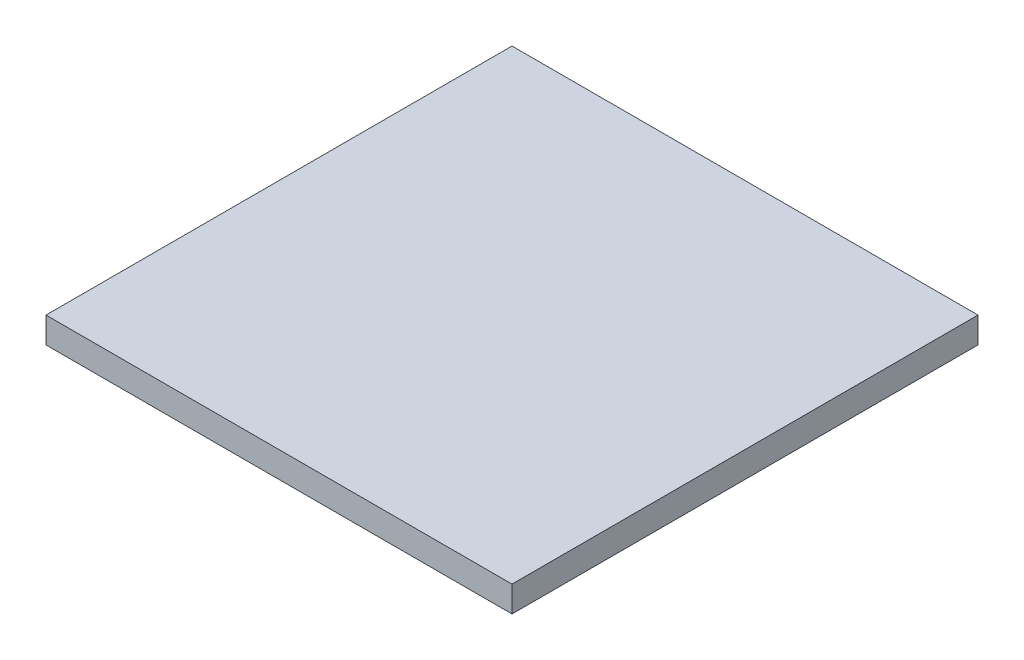
ISO-10303-21;
HEADER;
FILE_DESCRIPTION(('STEP AP214'),'2;1');
FILE_NAME('part.step','',(''),(''),'','','');
FILE_SCHEMA(('AUTOMOTIVE_DESIGN { 1 0 10303 214 1 1 1 1 }'));
ENDSEC;
DATA;
#1=APPLICATION_CONTEXT('core data for automotive mechanical design processes');
#2=APPLICATION_PROTOCOL_DEFINITION('international standard','automotive_design',2000,#1);
#3=PRODUCT_CONTEXT('',#1,'mechanical');
#4=PRODUCT('Part','Part','',(#3));
#5=PRODUCT_RELATED_PRODUCT_CATEGORY('part','',(#4));
#6=PRODUCT_DEFINITION_FORMATION('','',#4);
#7=PRODUCT_DEFINITION_CONTEXT('part definition',#1,'design');
#8=PRODUCT_DEFINITION('design','',#6,#7);
#9=PRODUCT_DEFINITION_SHAPE('','',#8);
#10=(LENGTH_UNIT() NAMED_UNIT(*) SI_UNIT(.MILLI.,.METRE.));
#11=(NAMED_UNIT(*) PLANE_ANGLE_UNIT() SI_UNIT($,.RADIAN.));
#12=(NAMED_UNIT(*) SI_UNIT($,.STERADIAN.) SOLID_ANGLE_UNIT());
#13=UNCERTAINTY_MEASURE_WITH_UNIT(LENGTH_MEASURE(1.E-05),#10,'distance_accuracy_value','');
#14=(GEOMETRIC_REPRESENTATION_CONTEXT(3) GLOBAL_UNCERTAINTY_ASSIGNED_CONTEXT((#13)) GLOBAL_UNIT_ASSIGNED_CONTEXT((#10,
#11,#12)) REPRESENTATION_CONTEXT('',''));
#15=CARTESIAN_POINT('',(0.,0.,0.));
#16=DIRECTION('',(0.,0.,1.));
#17=DIRECTION('',(1.,0.,0.));
#18=AXIS2_PLACEMENT_3D('',#15,#16,#17);
#19=CARTESIAN_POINT('',(0.,10.,0.));
#20=DIRECTION('',(1.,0.,0.));
#21=DIRECTION('',(0.,0.,-1.));
#22=AXIS2_PLACEMENT_3D('',#19,#20,#21);
#23=PLANE('',#22);
#24=DIRECTION('',(0.,0.,1.));
#25=VECTOR('',#24,1.);
#26=CARTESIAN_POINT('',(0.,0.,0.));
#27=LINE('',#26,#25);
#28=CARTESIAN_POINT('',(0.,0.,-180.));
#29=VERTEX_POINT('',#28);
#30=CARTESIAN_POINT('',(0.,0.,0.));
#31=VERTEX_POINT('',#30);
#32=EDGE_CURVE('E104',#29,#31,#27,.T.);
#33=ORIENTED_EDGE('',*,*,#32,.T.);
#34=DIRECTION('',(0.,-1.,0.));
#35=VECTOR('',#34,1.);
#36=CARTESIAN_POINT('',(0.,10.,0.));
#37=LINE('',#36,#35);
#38=CARTESIAN_POINT('',(0.,10.,0.));
#39=VERTEX_POINT('',#38);
#40=EDGE_CURVE('E11',#39,#31,#37,.T.);
#41=ORIENTED_EDGE('',*,*,#40,.F.);
#42=DIRECTION('',(0.,0.,1.));
#43=VECTOR('',#42,1.);
#44=CARTESIAN_POINT('',(0.,10.,0.));
#45=LINE('',#44,#43);
#46=CARTESIAN_POINT('',(0.,10.,-180.));
#47=VERTEX_POINT('',#46);
#48=EDGE_CURVE('E92',#47,#39,#45,.T.);
#49=ORIENTED_EDGE('',*,*,#48,.F.);
#50=DIRECTION('',(0.,-1.,0.));
#51=VECTOR('',#50,1.);
#52=CARTESIAN_POINT('',(0.,10.,-180.));
#53=LINE('',#52,#51);
#54=EDGE_CURVE('E100',#47,#29,#53,.T.);
#55=ORIENTED_EDGE('',*,*,#54,.T.);
#56=EDGE_LOOP('',(#33,#41,#49,#55));
#57=FACE_BOUND('',#56,.T.);
#58=ADVANCED_FACE('F41',(#57),#23,.F.);
#59=CARTESIAN_POINT('',(0.,10.,0.));
#60=DIRECTION('',(0.,0.,-1.));
#61=DIRECTION('',(-1.,0.,0.));
#62=AXIS2_PLACEMENT_3D('',#59,#60,#61);
#63=PLANE('',#62);
#64=DIRECTION('',(1.,0.,0.));
#65=VECTOR('',#64,1.);
#66=CARTESIAN_POINT('',(0.,0.,0.));
#67=LINE('',#66,#65);
#68=CARTESIAN_POINT('',(180.,0.,0.));
#69=VERTEX_POINT('',#68);
#70=EDGE_CURVE('E96',#31,#69,#67,.T.);
#71=ORIENTED_EDGE('',*,*,#70,.T.);
#72=DIRECTION('',(0.,-1.,0.));
#73=VECTOR('',#72,1.);
#74=CARTESIAN_POINT('',(180.,10.,0.));
#75=LINE('',#74,#73);
#76=CARTESIAN_POINT('',(180.,10.,0.));
#77=VERTEX_POINT('',#76);
#78=EDGE_CURVE('E49',#77,#69,#75,.T.);
#79=ORIENTED_EDGE('',*,*,#78,.F.);
#80=DIRECTION('',(1.,0.,0.));
#81=VECTOR('',#80,1.);
#82=CARTESIAN_POINT('',(0.,10.,0.));
#83=LINE('',#82,#81);
#84=EDGE_CURVE('E87',#39,#77,#83,.T.);
#85=ORIENTED_EDGE('',*,*,#84,.F.);
#86=ORIENTED_EDGE('',*,*,#40,.T.);
#87=EDGE_LOOP('',(#71,#79,#85,#86));
#88=FACE_BOUND('',#87,.T.);
#89=ADVANCED_FACE('F95',(#88),#63,.F.);
#90=CARTESIAN_POINT('',(180.,10.,0.));
#91=DIRECTION('',(-1.,0.,0.));
#92=DIRECTION('',(0.,0.,1.));
#93=AXIS2_PLACEMENT_3D('',#90,#91,#92);
#94=PLANE('',#93);
#95=DIRECTION('',(0.,0.,-1.));
#96=VECTOR('',#95,1.);
#97=CARTESIAN_POINT('',(180.,0.,0.));
#98=LINE('',#97,#96);
#99=CARTESIAN_POINT('',(180.,0.,-180.));
#100=VERTEX_POINT('',#99);
#101=EDGE_CURVE('E74',#69,#100,#98,.T.);
#102=ORIENTED_EDGE('',*,*,#101,.T.);
#103=DIRECTION('',(0.,-1.,0.));
#104=VECTOR('',#103,1.);
#105=CARTESIAN_POINT('',(180.,10.,-180.));
#106=LINE('',#105,#104);
#107=CARTESIAN_POINT('',(180.,10.,-180.));
#108=VERTEX_POINT('',#107);
#109=EDGE_CURVE('E97',#108,#100,#106,.T.);
#110=ORIENTED_EDGE('',*,*,#109,.F.);
#111=DIRECTION('',(0.,0.,-1.));
#112=VECTOR('',#111,1.);
#113=CARTESIAN_POINT('',(180.,10.,0.));
#114=LINE('',#113,#112);
#115=EDGE_CURVE('E90',#77,#108,#114,.T.);
#116=ORIENTED_EDGE('',*,*,#115,.F.);
#117=ORIENTED_EDGE('',*,*,#78,.T.);
#118=EDGE_LOOP('',(#102,#110,#116,#117));
#119=FACE_BOUND('',#118,.T.);
#120=ADVANCED_FACE('F98',(#119),#94,.F.);
#121=CARTESIAN_POINT('',(0.,10.,-180.));
#122=DIRECTION('',(0.,0.,1.));
#123=DIRECTION('',(1.,0.,0.));
#124=AXIS2_PLACEMENT_3D('',#121,#122,#123);
#125=PLANE('',#124);
#126=DIRECTION('',(-1.,0.,0.));
#127=VECTOR('',#126,1.);
#128=CARTESIAN_POINT('',(0.,0.,-180.));
#129=LINE('',#128,#127);
#130=EDGE_CURVE('E80',#100,#29,#129,.T.);
#131=ORIENTED_EDGE('',*,*,#130,.T.);
#132=ORIENTED_EDGE('',*,*,#54,.F.);
#133=DIRECTION('',(-1.,0.,0.));
#134=VECTOR('',#133,1.);
#135=CARTESIAN_POINT('',(0.,10.,-180.));
#136=LINE('',#135,#134);
#137=EDGE_CURVE('E57',#108,#47,#136,.T.);
#138=ORIENTED_EDGE('',*,*,#137,.F.);
#139=ORIENTED_EDGE('',*,*,#109,.T.);
#140=EDGE_LOOP('',(#131,#132,#138,#139));
#141=FACE_BOUND('',#140,.T.);
#142=ADVANCED_FACE('F111',(#141),#125,.F.);
#143=CARTESIAN_POINT('',(0.,10.,0.));
#144=DIRECTION('',(0.,-1.,0.));
#145=DIRECTION('',(0.,0.,-1.));
#146=AXIS2_PLACEMENT_3D('',#143,#144,#145);
#147=PLANE('',#146);
#148=ORIENTED_EDGE('',*,*,#48,.T.);
#149=ORIENTED_EDGE('',*,*,#84,.T.);
#150=ORIENTED_EDGE('',*,*,#115,.T.);
#151=ORIENTED_EDGE('',*,*,#137,.T.);
#152=EDGE_LOOP('',(#148,#149,#150,#151));
#153=FACE_BOUND('',#152,.T.);
#154=ADVANCED_FACE('F88',(#153),#147,.F.);
#155=CARTESIAN_POINT('',(0.,0.,0.));
#156=DIRECTION('',(0.,-1.,0.));
#157=DIRECTION('',(0.,0.,-1.));
#158=AXIS2_PLACEMENT_3D('',#155,#156,#157);
#159=PLANE('',#158);
#160=ORIENTED_EDGE('',*,*,#32,.F.);
#161=ORIENTED_EDGE('',*,*,#130,.F.);
#162=ORIENTED_EDGE('',*,*,#101,.F.);
#163=ORIENTED_EDGE('',*,*,#70,.F.);
#164=EDGE_LOOP('',(#160,#161,#162,#163));
#165=FACE_BOUND('',#164,.T.);
#166=ADVANCED_FACE('F114',(#165),#159,.T.);
#167=CLOSED_SHELL('',(#58,#89,#120,#142,#154,#166));
#168=MANIFOLD_SOLID_BREP('B2',#167);
#169=ADVANCED_BREP_SHAPE_REPRESENTATION('',(#18,#168),#14);
#170=SHAPE_DEFINITION_REPRESENTATION(#9,#169);
ENDSEC;
END-ISO-10303-21;
